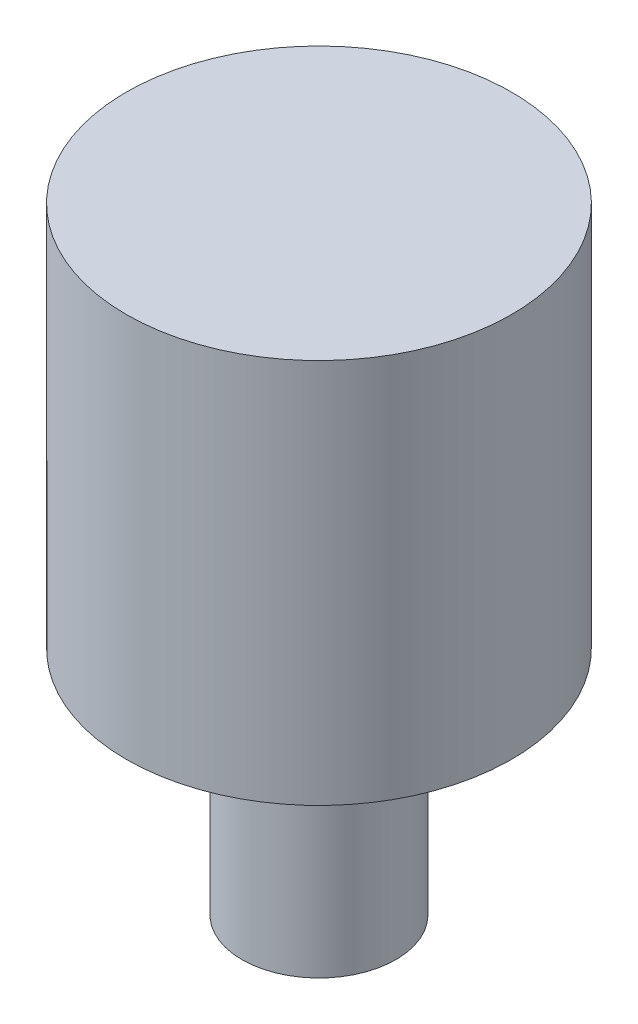
ISO-10303-21;
HEADER;
FILE_DESCRIPTION(('STEP AP214'),'2;1');
FILE_NAME('part.step','',(''),(''),'','','');
FILE_SCHEMA(('AUTOMOTIVE_DESIGN { 1 0 10303 214 1 1 1 1 }'));
ENDSEC;
DATA;
#1=APPLICATION_CONTEXT('core data for automotive mechanical design processes');
#2=APPLICATION_PROTOCOL_DEFINITION('international standard','automotive_design',2000,#1);
#3=PRODUCT_CONTEXT('',#1,'mechanical');
#4=PRODUCT('Part','Part','',(#3));
#5=PRODUCT_RELATED_PRODUCT_CATEGORY('part','',(#4));
#6=PRODUCT_DEFINITION_FORMATION('','',#4);
#7=PRODUCT_DEFINITION_CONTEXT('part definition',#1,'design');
#8=PRODUCT_DEFINITION('design','',#6,#7);
#9=PRODUCT_DEFINITION_SHAPE('','',#8);
#10=(LENGTH_UNIT() NAMED_UNIT(*) SI_UNIT(.MILLI.,.METRE.));
#11=(NAMED_UNIT(*) PLANE_ANGLE_UNIT() SI_UNIT($,.RADIAN.));
#12=(NAMED_UNIT(*) SI_UNIT($,.STERADIAN.) SOLID_ANGLE_UNIT());
#13=UNCERTAINTY_MEASURE_WITH_UNIT(LENGTH_MEASURE(1.E-05),#10,'distance_accuracy_value','');
#14=(GEOMETRIC_REPRESENTATION_CONTEXT(3) GLOBAL_UNCERTAINTY_ASSIGNED_CONTEXT((#13)) GLOBAL_UNIT_ASSIGNED_CONTEXT((#10,
#11,#12)) REPRESENTATION_CONTEXT('',''));
#15=CARTESIAN_POINT('',(0.,0.,0.));
#16=DIRECTION('',(0.,0.,1.));
#17=DIRECTION('',(1.,0.,0.));
#18=AXIS2_PLACEMENT_3D('',#15,#16,#17);
#19=CARTESIAN_POINT('',(-39.4787914004602,-2.,-56.3815572471546));
#20=DIRECTION('',(0.,1.,0.));
#21=DIRECTION('',(0.,0.,1.));
#22=AXIS2_PLACEMENT_3D('',#19,#20,#21);
#23=CYLINDRICAL_SURFACE('',#22,2.);
#24=CARTESIAN_POINT('',(-39.4787914004602,-2.,-56.3815572471546));
#25=DIRECTION('',(0.,1.,0.));
#26=DIRECTION('',(0.,0.,1.));
#27=AXIS2_PLACEMENT_3D('',#24,#25,#26);
#28=CIRCLE('',#27,2.);
#29=CARTESIAN_POINT('',(-39.4787914004602,-2.,-54.3815572471546));
#30=VERTEX_POINT('',#29);
#31=EDGE_CURVE('E10',#30,#30,#28,.F.);
#32=ORIENTED_EDGE('',*,*,#31,.F.);
#33=EDGE_LOOP('',(#32));
#34=FACE_BOUND('',#33,.T.);
#35=CARTESIAN_POINT('',(-39.4787914004602,4.,-56.3815572471546));
#36=DIRECTION('',(0.,1.,0.));
#37=DIRECTION('',(0.,0.,1.));
#38=AXIS2_PLACEMENT_3D('',#35,#36,#37);
#39=CIRCLE('',#38,2.);
#40=CARTESIAN_POINT('',(-39.4787914004602,4.,-54.3815572471546));
#41=VERTEX_POINT('',#40);
#42=EDGE_CURVE('E36',#41,#41,#39,.F.);
#43=ORIENTED_EDGE('',*,*,#42,.T.);
#44=EDGE_LOOP('',(#43));
#45=FACE_BOUND('',#44,.T.);
#46=ADVANCED_FACE('F33',(#34,#45),#23,.T.);
#47=CARTESIAN_POINT('',(0.,-2.,0.));
#48=DIRECTION('',(0.,1.,0.));
#49=DIRECTION('',(0.,0.,1.));
#50=AXIS2_PLACEMENT_3D('',#47,#48,#49);
#51=PLANE('',#50);
#52=ORIENTED_EDGE('',*,*,#31,.T.);
#53=EDGE_LOOP('',(#52));
#54=FACE_BOUND('',#53,.T.);
#55=ADVANCED_FACE('F56',(#54),#51,.F.);
#56=CARTESIAN_POINT('',(-39.4787914004602,14.,-56.3815572471546));
#57=DIRECTION('',(0.,-1.,0.));
#58=DIRECTION('',(0.,0.,-1.));
#59=AXIS2_PLACEMENT_3D('',#56,#57,#58);
#60=CYLINDRICAL_SURFACE('',#59,5.);
#61=CARTESIAN_POINT('',(-39.4787914004602,14.,-56.3815572471546));
#62=DIRECTION('',(0.,1.,0.));
#63=DIRECTION('',(0.,0.,1.));
#64=AXIS2_PLACEMENT_3D('',#61,#62,#63);
#65=CIRCLE('',#64,5.);
#66=CARTESIAN_POINT('',(-39.4787914004602,14.,-51.3815572471546));
#67=VERTEX_POINT('',#66);
#68=EDGE_CURVE('E43',#67,#67,#65,.T.);
#69=ORIENTED_EDGE('',*,*,#68,.F.);
#70=EDGE_LOOP('',(#69));
#71=FACE_BOUND('',#70,.T.);
#72=CARTESIAN_POINT('',(-39.4787914004602,4.,-56.3815572471546));
#73=DIRECTION('',(0.,1.,0.));
#74=DIRECTION('',(0.,0.,1.));
#75=AXIS2_PLACEMENT_3D('',#72,#73,#74);
#76=CIRCLE('',#75,5.);
#77=CARTESIAN_POINT('',(-39.4787914004602,4.,-51.3815572471546));
#78=VERTEX_POINT('',#77);
#79=EDGE_CURVE('E45',#78,#78,#76,.T.);
#80=ORIENTED_EDGE('',*,*,#79,.T.);
#81=EDGE_LOOP('',(#80));
#82=FACE_BOUND('',#81,.T.);
#83=ADVANCED_FACE('F53',(#71,#82),#60,.T.);
#84=CARTESIAN_POINT('',(-39.4787914004602,14.,-56.3815572471546));
#85=DIRECTION('',(0.,1.,0.));
#86=DIRECTION('',(0.,0.,1.));
#87=AXIS2_PLACEMENT_3D('',#84,#85,#86);
#88=PLANE('',#87);
#89=ORIENTED_EDGE('',*,*,#68,.T.);
#90=EDGE_LOOP('',(#89));
#91=FACE_BOUND('',#90,.T.);
#92=ADVANCED_FACE('F51',(#91),#88,.T.);
#93=CARTESIAN_POINT('',(-39.4787914004602,4.,-56.3815572471546));
#94=DIRECTION('',(0.,1.,0.));
#95=DIRECTION('',(0.,0.,1.));
#96=AXIS2_PLACEMENT_3D('',#93,#94,#95);
#97=PLANE('',#96);
#98=ORIENTED_EDGE('',*,*,#42,.F.);
#99=EDGE_LOOP('',(#98));
#100=FACE_BOUND('',#99,.T.);
#101=ORIENTED_EDGE('',*,*,#79,.F.);
#102=EDGE_LOOP('',(#101));
#103=FACE_BOUND('',#102,.T.);
#104=ADVANCED_FACE('F60',(#100,#103),#97,.F.);
#105=CLOSED_SHELL('',(#46,#55,#83,#92,#104));
#106=MANIFOLD_SOLID_BREP('B2',#105);
#107=ADVANCED_BREP_SHAPE_REPRESENTATION('',(#18,#106),#14);
#108=SHAPE_DEFINITION_REPRESENTATION(#9,#107);
ENDSEC;
END-ISO-10303-21;
